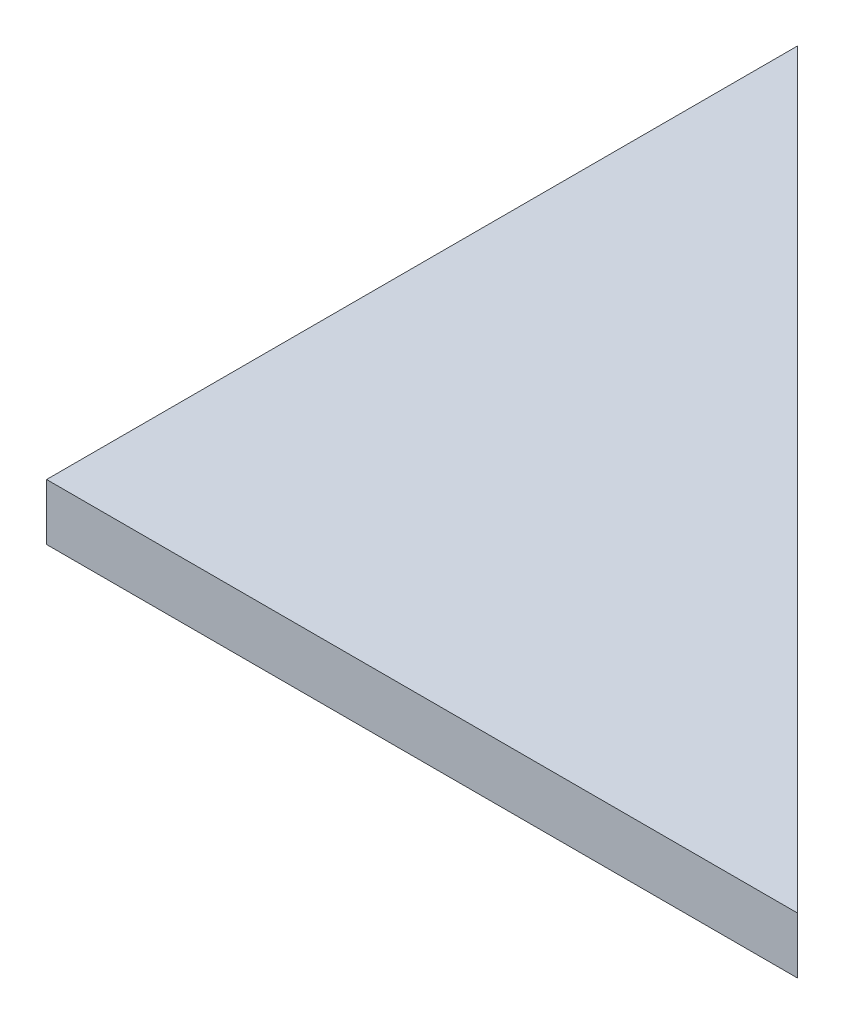
ISO-10303-21;
HEADER;
FILE_DESCRIPTION(('STEP AP214'),'2;1');
FILE_NAME('part.step','',(''),(''),'','','');
FILE_SCHEMA(('AUTOMOTIVE_DESIGN { 1 0 10303 214 1 1 1 1 }'));
ENDSEC;
DATA;
#1=APPLICATION_CONTEXT('core data for automotive mechanical design processes');
#2=APPLICATION_PROTOCOL_DEFINITION('international standard','automotive_design',2000,#1);
#3=PRODUCT_CONTEXT('',#1,'mechanical');
#4=PRODUCT('Part','Part','',(#3));
#5=PRODUCT_RELATED_PRODUCT_CATEGORY('part','',(#4));
#6=PRODUCT_DEFINITION_FORMATION('','',#4);
#7=PRODUCT_DEFINITION_CONTEXT('part definition',#1,'design');
#8=PRODUCT_DEFINITION('design','',#6,#7);
#9=PRODUCT_DEFINITION_SHAPE('','',#8);
#10=(LENGTH_UNIT() NAMED_UNIT(*) SI_UNIT(.MILLI.,.METRE.));
#11=(NAMED_UNIT(*) PLANE_ANGLE_UNIT() SI_UNIT($,.RADIAN.));
#12=(NAMED_UNIT(*) SI_UNIT($,.STERADIAN.) SOLID_ANGLE_UNIT());
#13=UNCERTAINTY_MEASURE_WITH_UNIT(LENGTH_MEASURE(1.E-05),#10,'distance_accuracy_value','');
#14=(GEOMETRIC_REPRESENTATION_CONTEXT(3) GLOBAL_UNCERTAINTY_ASSIGNED_CONTEXT((#13)) GLOBAL_UNIT_ASSIGNED_CONTEXT((#10,
#11,#12)) REPRESENTATION_CONTEXT('',''));
#15=CARTESIAN_POINT('',(0.,0.,0.));
#16=DIRECTION('',(0.,0.,1.));
#17=DIRECTION('',(1.,0.,0.));
#18=AXIS2_PLACEMENT_3D('',#15,#16,#17);
#19=CARTESIAN_POINT('',(0.,1.5,-20.));
#20=DIRECTION('',(1.,0.,0.));
#21=DIRECTION('',(0.,0.,-1.));
#22=AXIS2_PLACEMENT_3D('',#19,#20,#21);
#23=PLANE('',#22);
#24=DIRECTION('',(0.,0.,1.));
#25=VECTOR('',#24,1.);
#26=CARTESIAN_POINT('',(0.,0.,-20.));
#27=LINE('',#26,#25);
#28=CARTESIAN_POINT('',(0.,0.,-20.));
#29=VERTEX_POINT('',#28);
#30=CARTESIAN_POINT('',(0.,0.,0.));
#31=VERTEX_POINT('',#30);
#32=EDGE_CURVE('E89',#29,#31,#27,.T.);
#33=ORIENTED_EDGE('',*,*,#32,.T.);
#34=DIRECTION('',(0.,-1.,0.));
#35=VECTOR('',#34,1.);
#36=CARTESIAN_POINT('',(0.,1.5,0.));
#37=LINE('',#36,#35);
#38=CARTESIAN_POINT('',(0.,1.5,0.));
#39=VERTEX_POINT('',#38);
#40=EDGE_CURVE('E11',#39,#31,#37,.T.);
#41=ORIENTED_EDGE('',*,*,#40,.F.);
#42=DIRECTION('',(0.,0.,1.));
#43=VECTOR('',#42,1.);
#44=CARTESIAN_POINT('',(0.,1.5,-20.));
#45=LINE('',#44,#43);
#46=CARTESIAN_POINT('',(0.,1.5,-20.));
#47=VERTEX_POINT('',#46);
#48=EDGE_CURVE('E81',#47,#39,#45,.T.);
#49=ORIENTED_EDGE('',*,*,#48,.F.);
#50=DIRECTION('',(0.,-1.,0.));
#51=VECTOR('',#50,1.);
#52=CARTESIAN_POINT('',(0.,1.5,-20.));
#53=LINE('',#52,#51);
#54=EDGE_CURVE('E90',#47,#29,#53,.T.);
#55=ORIENTED_EDGE('',*,*,#54,.T.);
#56=EDGE_LOOP('',(#33,#41,#49,#55));
#57=FACE_BOUND('',#56,.T.);
#58=ADVANCED_FACE('F39',(#57),#23,.F.);
#59=CARTESIAN_POINT('',(0.,1.5,0.));
#60=DIRECTION('',(0.,0.,-1.));
#61=DIRECTION('',(-1.,0.,0.));
#62=AXIS2_PLACEMENT_3D('',#59,#60,#61);
#63=PLANE('',#62);
#64=DIRECTION('',(1.,0.,0.));
#65=VECTOR('',#64,1.);
#66=CARTESIAN_POINT('',(0.,0.,0.));
#67=LINE('',#66,#65);
#68=CARTESIAN_POINT('',(20.,0.,0.));
#69=VERTEX_POINT('',#68);
#70=EDGE_CURVE('E68',#31,#69,#67,.T.);
#71=ORIENTED_EDGE('',*,*,#70,.T.);
#72=DIRECTION('',(0.,-1.,0.));
#73=VECTOR('',#72,1.);
#74=CARTESIAN_POINT('',(20.,1.5,0.));
#75=LINE('',#74,#73);
#76=CARTESIAN_POINT('',(20.,1.5,0.));
#77=VERTEX_POINT('',#76);
#78=EDGE_CURVE('E48',#77,#69,#75,.T.);
#79=ORIENTED_EDGE('',*,*,#78,.F.);
#80=DIRECTION('',(1.,0.,0.));
#81=VECTOR('',#80,1.);
#82=CARTESIAN_POINT('',(0.,1.5,0.));
#83=LINE('',#82,#81);
#84=EDGE_CURVE('E76',#39,#77,#83,.T.);
#85=ORIENTED_EDGE('',*,*,#84,.F.);
#86=ORIENTED_EDGE('',*,*,#40,.T.);
#87=EDGE_LOOP('',(#71,#79,#85,#86));
#88=FACE_BOUND('',#87,.T.);
#89=ADVANCED_FACE('F77',(#88),#63,.F.);
#90=CARTESIAN_POINT('',(20.,1.5,0.));
#91=DIRECTION('',(-0.707106781186547,0.,0.707106781186547));
#92=DIRECTION('',(0.707106781186548,0.,0.707106781186548));
#93=AXIS2_PLACEMENT_3D('',#90,#91,#92);
#94=PLANE('',#93);
#95=DIRECTION('',(-0.707106781186548,0.,-0.707106781186548));
#96=VECTOR('',#95,1.);
#97=CARTESIAN_POINT('',(20.,0.,0.));
#98=LINE('',#97,#96);
#99=EDGE_CURVE('E73',#69,#29,#98,.T.);
#100=ORIENTED_EDGE('',*,*,#99,.T.);
#101=ORIENTED_EDGE('',*,*,#54,.F.);
#102=DIRECTION('',(-0.707106781186548,0.,-0.707106781186548));
#103=VECTOR('',#102,1.);
#104=CARTESIAN_POINT('',(20.,1.5,0.));
#105=LINE('',#104,#103);
#106=EDGE_CURVE('E56',#77,#47,#105,.T.);
#107=ORIENTED_EDGE('',*,*,#106,.F.);
#108=ORIENTED_EDGE('',*,*,#78,.T.);
#109=EDGE_LOOP('',(#100,#101,#107,#108));
#110=FACE_BOUND('',#109,.T.);
#111=ADVANCED_FACE('F102',(#110),#94,.F.);
#112=CARTESIAN_POINT('',(0.,1.5,0.));
#113=DIRECTION('',(0.,1.,0.));
#114=DIRECTION('',(0.,0.,1.));
#115=AXIS2_PLACEMENT_3D('',#112,#113,#114);
#116=PLANE('',#115);
#117=ORIENTED_EDGE('',*,*,#48,.T.);
#118=ORIENTED_EDGE('',*,*,#84,.T.);
#119=ORIENTED_EDGE('',*,*,#106,.T.);
#120=EDGE_LOOP('',(#117,#118,#119));
#121=FACE_BOUND('',#120,.T.);
#122=ADVANCED_FACE('F84',(#121),#116,.T.);
#123=CARTESIAN_POINT('',(0.,0.,0.));
#124=DIRECTION('',(0.,1.,0.));
#125=DIRECTION('',(0.,0.,1.));
#126=AXIS2_PLACEMENT_3D('',#123,#124,#125);
#127=PLANE('',#126);
#128=ORIENTED_EDGE('',*,*,#32,.F.);
#129=ORIENTED_EDGE('',*,*,#99,.F.);
#130=ORIENTED_EDGE('',*,*,#70,.F.);
#131=EDGE_LOOP('',(#128,#129,#130));
#132=FACE_BOUND('',#131,.T.);
#133=ADVANCED_FACE('F103',(#132),#127,.F.);
#134=CLOSED_SHELL('',(#58,#89,#111,#122,#133));
#135=MANIFOLD_SOLID_BREP('B2',#134);
#136=ADVANCED_BREP_SHAPE_REPRESENTATION('',(#18,#135),#14);
#137=SHAPE_DEFINITION_REPRESENTATION(#9,#136);
ENDSEC;
END-ISO-10303-21;
